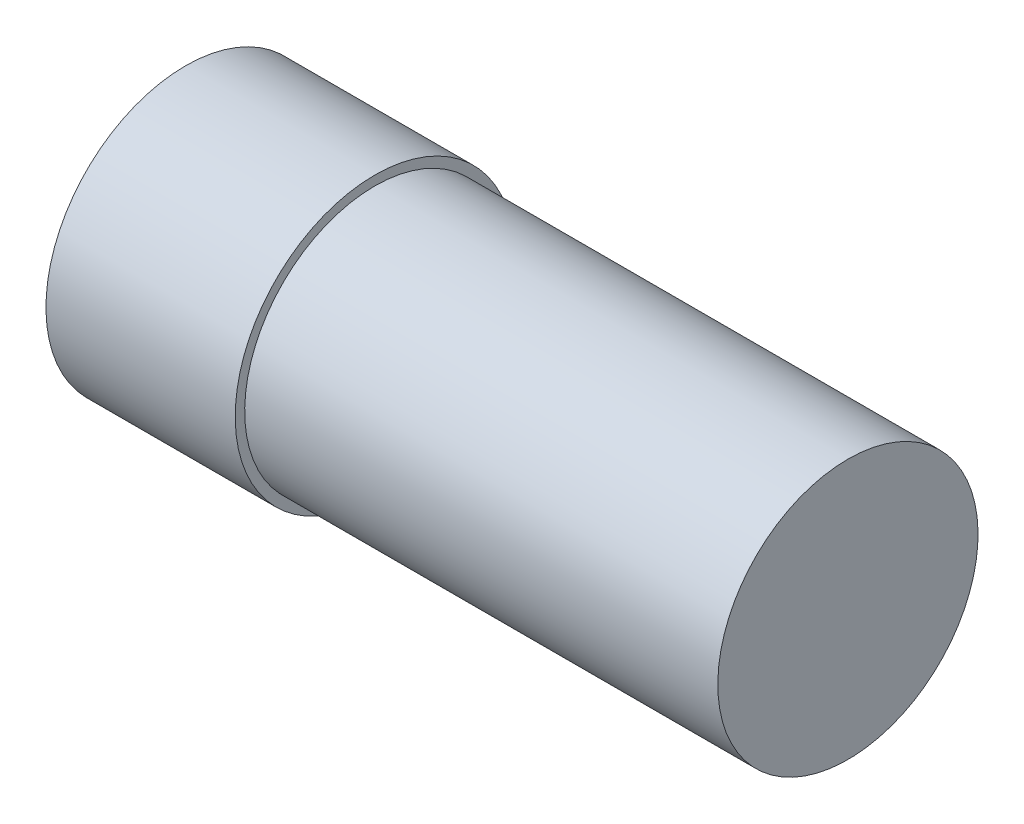
ISO-10303-21;
HEADER;
FILE_DESCRIPTION(('STEP AP214'),'2;1');
FILE_NAME('part.step','',(''),(''),'','','');
FILE_SCHEMA(('AUTOMOTIVE_DESIGN { 1 0 10303 214 1 1 1 1 }'));
ENDSEC;
DATA;
#1=APPLICATION_CONTEXT('core data for automotive mechanical design processes');
#2=APPLICATION_PROTOCOL_DEFINITION('international standard','automotive_design',2000,#1);
#3=PRODUCT_CONTEXT('',#1,'mechanical');
#4=PRODUCT('Part','Part','',(#3));
#5=PRODUCT_RELATED_PRODUCT_CATEGORY('part','',(#4));
#6=PRODUCT_DEFINITION_FORMATION('','',#4);
#7=PRODUCT_DEFINITION_CONTEXT('part definition',#1,'design');
#8=PRODUCT_DEFINITION('design','',#6,#7);
#9=PRODUCT_DEFINITION_SHAPE('','',#8);
#10=(LENGTH_UNIT() NAMED_UNIT(*) SI_UNIT(.MILLI.,.METRE.));
#11=(NAMED_UNIT(*) PLANE_ANGLE_UNIT() SI_UNIT($,.RADIAN.));
#12=(NAMED_UNIT(*) SI_UNIT($,.STERADIAN.) SOLID_ANGLE_UNIT());
#13=UNCERTAINTY_MEASURE_WITH_UNIT(LENGTH_MEASURE(1.E-05),#10,'distance_accuracy_value','');
#14=(GEOMETRIC_REPRESENTATION_CONTEXT(3) GLOBAL_UNCERTAINTY_ASSIGNED_CONTEXT((#13)) GLOBAL_UNIT_ASSIGNED_CONTEXT((#10,
#11,#12)) REPRESENTATION_CONTEXT('',''));
#15=CARTESIAN_POINT('',(0.,0.,0.));
#16=DIRECTION('',(0.,0.,1.));
#17=DIRECTION('',(1.,0.,0.));
#18=AXIS2_PLACEMENT_3D('',#15,#16,#17);
#19=CARTESIAN_POINT('',(0.,0.,0.));
#20=DIRECTION('',(-1.,0.,0.));
#21=DIRECTION('',(0.,-1.,0.));
#22=AXIS2_PLACEMENT_3D('',#19,#20,#21);
#23=PLANE('',#22);
#24=CARTESIAN_POINT('',(0.,0.,0.));
#25=DIRECTION('',(1.,0.,0.));
#26=DIRECTION('',(0.,1.,0.));
#27=AXIS2_PLACEMENT_3D('',#24,#25,#26);
#28=CIRCLE('',#27,29.5);
#29=CARTESIAN_POINT('',(0.,29.5,0.));
#30=VERTEX_POINT('',#29);
#31=EDGE_CURVE('E10',#30,#30,#28,.T.);
#32=ORIENTED_EDGE('',*,*,#31,.F.);
#33=EDGE_LOOP('',(#32));
#34=FACE_BOUND('',#33,.T.);
#35=ADVANCED_FACE('F32',(#34),#23,.T.);
#36=CARTESIAN_POINT('',(140.,0.,0.));
#37=DIRECTION('',(1.,0.,0.));
#38=DIRECTION('',(0.,1.,0.));
#39=AXIS2_PLACEMENT_3D('',#36,#37,#38);
#40=CYLINDRICAL_SURFACE('',#39,29.5);
#41=ORIENTED_EDGE('',*,*,#31,.T.);
#42=EDGE_LOOP('',(#41));
#43=FACE_BOUND('',#42,.T.);
#44=CARTESIAN_POINT('',(40.,0.,0.));
#45=DIRECTION('',(1.,0.,0.));
#46=DIRECTION('',(0.,1.,0.));
#47=AXIS2_PLACEMENT_3D('',#44,#45,#46);
#48=CIRCLE('',#47,29.5);
#49=CARTESIAN_POINT('',(40.,29.5,0.));
#50=VERTEX_POINT('',#49);
#51=EDGE_CURVE('E38',#50,#50,#48,.T.);
#52=ORIENTED_EDGE('',*,*,#51,.F.);
#53=EDGE_LOOP('',(#52));
#54=FACE_BOUND('',#53,.T.);
#55=ADVANCED_FACE('F64',(#43,#54),#40,.T.);
#56=CARTESIAN_POINT('',(40.,29.5,0.));
#57=DIRECTION('',(1.,0.,0.));
#58=DIRECTION('',(0.,1.,0.));
#59=AXIS2_PLACEMENT_3D('',#56,#57,#58);
#60=PLANE('',#59);
#61=ORIENTED_EDGE('',*,*,#51,.T.);
#62=EDGE_LOOP('',(#61));
#63=FACE_BOUND('',#62,.T.);
#64=CARTESIAN_POINT('',(40.,0.,0.));
#65=DIRECTION('',(1.,0.,0.));
#66=DIRECTION('',(0.,1.,0.));
#67=AXIS2_PLACEMENT_3D('',#64,#65,#66);
#68=CIRCLE('',#67,27.5);
#69=CARTESIAN_POINT('',(40.,27.5,0.));
#70=VERTEX_POINT('',#69);
#71=EDGE_CURVE('E42',#70,#70,#68,.T.);
#72=ORIENTED_EDGE('',*,*,#71,.F.);
#73=EDGE_LOOP('',(#72));
#74=FACE_BOUND('',#73,.T.);
#75=ADVANCED_FACE('F56',(#63,#74),#60,.T.);
#76=CARTESIAN_POINT('',(140.,0.,0.));
#77=DIRECTION('',(1.,0.,0.));
#78=DIRECTION('',(0.,1.,0.));
#79=AXIS2_PLACEMENT_3D('',#76,#77,#78);
#80=CYLINDRICAL_SURFACE('',#79,27.5);
#81=ORIENTED_EDGE('',*,*,#71,.T.);
#82=EDGE_LOOP('',(#81));
#83=FACE_BOUND('',#82,.T.);
#84=CARTESIAN_POINT('',(140.,0.,0.));
#85=DIRECTION('',(1.,0.,0.));
#86=DIRECTION('',(0.,1.,0.));
#87=AXIS2_PLACEMENT_3D('',#84,#85,#86);
#88=CIRCLE('',#87,27.5);
#89=CARTESIAN_POINT('',(140.,27.5,0.));
#90=VERTEX_POINT('',#89);
#91=EDGE_CURVE('E46',#90,#90,#88,.T.);
#92=ORIENTED_EDGE('',*,*,#91,.F.);
#93=EDGE_LOOP('',(#92));
#94=FACE_BOUND('',#93,.T.);
#95=ADVANCED_FACE('F54',(#83,#94),#80,.T.);
#96=CARTESIAN_POINT('',(140.,27.5,0.));
#97=DIRECTION('',(1.,0.,0.));
#98=DIRECTION('',(0.,1.,0.));
#99=AXIS2_PLACEMENT_3D('',#96,#97,#98);
#100=PLANE('',#99);
#101=ORIENTED_EDGE('',*,*,#91,.T.);
#102=EDGE_LOOP('',(#101));
#103=FACE_BOUND('',#102,.T.);
#104=ADVANCED_FACE('F52',(#103),#100,.T.);
#105=CLOSED_SHELL('',(#35,#55,#75,#95,#104));
#106=MANIFOLD_SOLID_BREP('B2',#105);
#107=ADVANCED_BREP_SHAPE_REPRESENTATION('',(#18,#106),#14);
#108=SHAPE_DEFINITION_REPRESENTATION(#9,#107);
ENDSEC;
END-ISO-10303-21;
